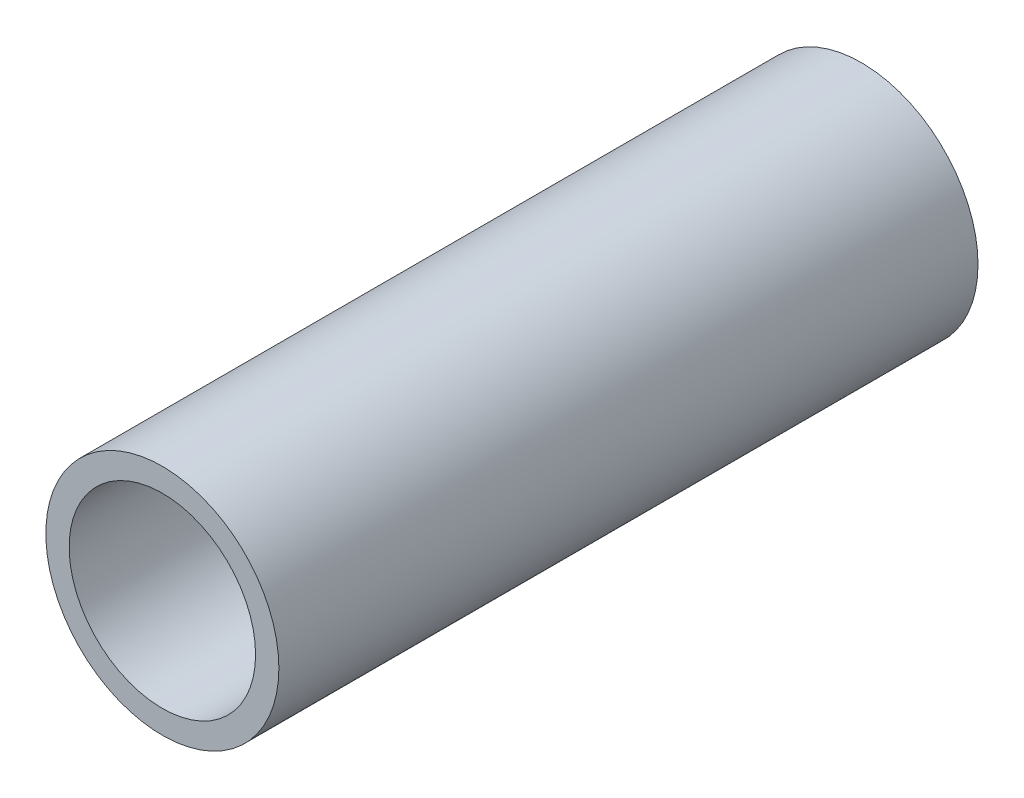
ISO-10303-21;
HEADER;
FILE_DESCRIPTION(('STEP AP214'),'2;1');
FILE_NAME('part.step','',(''),(''),'','','');
FILE_SCHEMA(('AUTOMOTIVE_DESIGN { 1 0 10303 214 1 1 1 1 }'));
ENDSEC;
DATA;
#1=APPLICATION_CONTEXT('core data for automotive mechanical design processes');
#2=APPLICATION_PROTOCOL_DEFINITION('international standard','automotive_design',2000,#1);
#3=PRODUCT_CONTEXT('',#1,'mechanical');
#4=PRODUCT('Part','Part','',(#3));
#5=PRODUCT_RELATED_PRODUCT_CATEGORY('part','',(#4));
#6=PRODUCT_DEFINITION_FORMATION('','',#4);
#7=PRODUCT_DEFINITION_CONTEXT('part definition',#1,'design');
#8=PRODUCT_DEFINITION('design','',#6,#7);
#9=PRODUCT_DEFINITION_SHAPE('','',#8);
#10=(LENGTH_UNIT() NAMED_UNIT(*) SI_UNIT(.MILLI.,.METRE.));
#11=(NAMED_UNIT(*) PLANE_ANGLE_UNIT() SI_UNIT($,.RADIAN.));
#12=(NAMED_UNIT(*) SI_UNIT($,.STERADIAN.) SOLID_ANGLE_UNIT());
#13=UNCERTAINTY_MEASURE_WITH_UNIT(LENGTH_MEASURE(1.E-05),#10,'distance_accuracy_value','');
#14=(GEOMETRIC_REPRESENTATION_CONTEXT(3) GLOBAL_UNCERTAINTY_ASSIGNED_CONTEXT((#13)) GLOBAL_UNIT_ASSIGNED_CONTEXT((#10,
#11,#12)) REPRESENTATION_CONTEXT('',''));
#15=CARTESIAN_POINT('',(0.,0.,0.));
#16=DIRECTION('',(0.,0.,1.));
#17=DIRECTION('',(1.,0.,0.));
#18=AXIS2_PLACEMENT_3D('',#15,#16,#17);
#19=CARTESIAN_POINT('',(0.,0.,37.5));
#20=DIRECTION('',(0.,0.,1.));
#21=DIRECTION('',(1.,0.,0.));
#22=AXIS2_PLACEMENT_3D('',#19,#20,#21);
#23=PLANE('',#22);
#24=CARTESIAN_POINT('',(0.,0.,37.5));
#25=DIRECTION('',(0.,0.,1.));
#26=DIRECTION('',(1.,0.,0.));
#27=AXIS2_PLACEMENT_3D('',#24,#25,#26);
#28=CIRCLE('',#27,12.5);
#29=CARTESIAN_POINT('',(12.5,0.,37.5));
#30=VERTEX_POINT('',#29);
#31=EDGE_CURVE('E10',#30,#30,#28,.T.);
#32=ORIENTED_EDGE('',*,*,#31,.T.);
#33=EDGE_LOOP('',(#32));
#34=FACE_BOUND('',#33,.T.);
#35=CARTESIAN_POINT('',(0.,0.,37.5));
#36=DIRECTION('',(0.,0.,1.));
#37=DIRECTION('',(1.,0.,0.));
#38=AXIS2_PLACEMENT_3D('',#35,#36,#37);
#39=CIRCLE('',#38,10.);
#40=CARTESIAN_POINT('',(10.,0.,37.5));
#41=VERTEX_POINT('',#40);
#42=EDGE_CURVE('E50',#41,#41,#39,.T.);
#43=ORIENTED_EDGE('',*,*,#42,.F.);
#44=EDGE_LOOP('',(#43));
#45=FACE_BOUND('',#44,.T.);
#46=ADVANCED_FACE('F37',(#34,#45),#23,.T.);
#47=CARTESIAN_POINT('',(0.,0.,-37.5));
#48=DIRECTION('',(0.,0.,1.));
#49=DIRECTION('',(1.,0.,0.));
#50=AXIS2_PLACEMENT_3D('',#47,#48,#49);
#51=PLANE('',#50);
#52=CARTESIAN_POINT('',(0.,0.,-37.5));
#53=DIRECTION('',(0.,0.,1.));
#54=DIRECTION('',(1.,0.,0.));
#55=AXIS2_PLACEMENT_3D('',#52,#53,#54);
#56=CIRCLE('',#55,12.5);
#57=CARTESIAN_POINT('',(12.5,0.,-37.5));
#58=VERTEX_POINT('',#57);
#59=EDGE_CURVE('E41',#58,#58,#56,.T.);
#60=ORIENTED_EDGE('',*,*,#59,.F.);
#61=EDGE_LOOP('',(#60));
#62=FACE_BOUND('',#61,.T.);
#63=CARTESIAN_POINT('',(0.,0.,-37.5));
#64=DIRECTION('',(0.,0.,1.));
#65=DIRECTION('',(1.,0.,0.));
#66=AXIS2_PLACEMENT_3D('',#63,#64,#65);
#67=CIRCLE('',#66,10.);
#68=CARTESIAN_POINT('',(10.,0.,-37.5));
#69=VERTEX_POINT('',#68);
#70=EDGE_CURVE('E52',#69,#69,#67,.T.);
#71=ORIENTED_EDGE('',*,*,#70,.T.);
#72=EDGE_LOOP('',(#71));
#73=FACE_BOUND('',#72,.T.);
#74=ADVANCED_FACE('F64',(#62,#73),#51,.F.);
#75=CARTESIAN_POINT('',(0.,0.,37.5));
#76=DIRECTION('',(0.,0.,-1.));
#77=DIRECTION('',(-1.,0.,0.));
#78=AXIS2_PLACEMENT_3D('',#75,#76,#77);
#79=CYLINDRICAL_SURFACE('',#78,12.5);
#80=ORIENTED_EDGE('',*,*,#31,.F.);
#81=EDGE_LOOP('',(#80));
#82=FACE_BOUND('',#81,.T.);
#83=ORIENTED_EDGE('',*,*,#59,.T.);
#84=EDGE_LOOP('',(#83));
#85=FACE_BOUND('',#84,.T.);
#86=ADVANCED_FACE('F39',(#82,#85),#79,.T.);
#87=CARTESIAN_POINT('',(0.,0.,37.5));
#88=DIRECTION('',(0.,0.,-1.));
#89=DIRECTION('',(-1.,0.,0.));
#90=AXIS2_PLACEMENT_3D('',#87,#88,#89);
#91=CYLINDRICAL_SURFACE('',#90,10.);
#92=ORIENTED_EDGE('',*,*,#42,.T.);
#93=EDGE_LOOP('',(#92));
#94=FACE_BOUND('',#93,.T.);
#95=ORIENTED_EDGE('',*,*,#70,.F.);
#96=EDGE_LOOP('',(#95));
#97=FACE_BOUND('',#96,.T.);
#98=ADVANCED_FACE('F60',(#94,#97),#91,.F.);
#99=CLOSED_SHELL('',(#46,#74,#86,#98));
#100=MANIFOLD_SOLID_BREP('B2',#99);
#101=ADVANCED_BREP_SHAPE_REPRESENTATION('',(#18,#100),#14);
#102=SHAPE_DEFINITION_REPRESENTATION(#9,#101);
ENDSEC;
END-ISO-10303-21;
